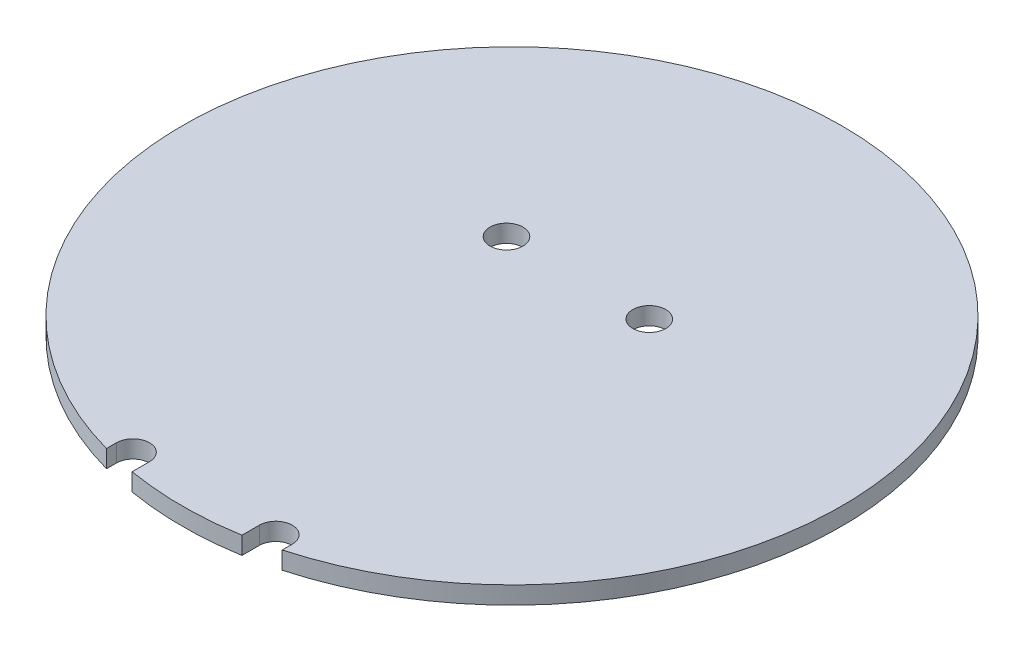
ISO-10303-21;
HEADER;
FILE_DESCRIPTION(('STEP AP214'),'2;1');
FILE_NAME('part.step','',(''),(''),'','','');
FILE_SCHEMA(('AUTOMOTIVE_DESIGN { 1 0 10303 214 1 1 1 1 }'));
ENDSEC;
DATA;
#1=APPLICATION_CONTEXT('core data for automotive mechanical design processes');
#2=APPLICATION_PROTOCOL_DEFINITION('international standard','automotive_design',2000,#1);
#3=PRODUCT_CONTEXT('',#1,'mechanical');
#4=PRODUCT('Part','Part','',(#3));
#5=PRODUCT_RELATED_PRODUCT_CATEGORY('part','',(#4));
#6=PRODUCT_DEFINITION_FORMATION('','',#4);
#7=PRODUCT_DEFINITION_CONTEXT('part definition',#1,'design');
#8=PRODUCT_DEFINITION('design','',#6,#7);
#9=PRODUCT_DEFINITION_SHAPE('','',#8);
#10=(LENGTH_UNIT() NAMED_UNIT(*) SI_UNIT(.MILLI.,.METRE.));
#11=(NAMED_UNIT(*) PLANE_ANGLE_UNIT() SI_UNIT($,.RADIAN.));
#12=(NAMED_UNIT(*) SI_UNIT($,.STERADIAN.) SOLID_ANGLE_UNIT());
#13=UNCERTAINTY_MEASURE_WITH_UNIT(LENGTH_MEASURE(1.E-05),#10,'distance_accuracy_value','');
#14=(GEOMETRIC_REPRESENTATION_CONTEXT(3) GLOBAL_UNCERTAINTY_ASSIGNED_CONTEXT((#13)) GLOBAL_UNIT_ASSIGNED_CONTEXT((#10,
#11,#12)) REPRESENTATION_CONTEXT('',''));
#15=CARTESIAN_POINT('',(0.,0.,0.));
#16=DIRECTION('',(0.,0.,1.));
#17=DIRECTION('',(1.,0.,0.));
#18=AXIS2_PLACEMENT_3D('',#15,#16,#17);
#19=CARTESIAN_POINT('',(0.,0.,0.));
#20=DIRECTION('',(0.,1.,0.));
#21=DIRECTION('',(0.,0.,1.));
#22=AXIS2_PLACEMENT_3D('',#19,#20,#21);
#23=PLANE('',#22);
#24=DIRECTION('',(0.,0.,1.));
#25=VECTOR('',#24,1.);
#26=CARTESIAN_POINT('',(-3.99999999999991,0.,15.6468387489926));
#27=LINE('',#26,#25);
#28=CARTESIAN_POINT('',(-3.99999999999993,0.,14.));
#29=VERTEX_POINT('',#28);
#30=CARTESIAN_POINT('',(-3.99999999999991,0.,14.456832294801));
#31=VERTEX_POINT('',#30);
#32=EDGE_CURVE('E83',#29,#31,#27,.T.);
#33=ORIENTED_EDGE('',*,*,#32,.T.);
#34=CARTESIAN_POINT('',(0.,0.,0.));
#35=DIRECTION('',(0.,-1.,0.));
#36=DIRECTION('',(0.,0.,-1.));
#37=AXIS2_PLACEMENT_3D('',#34,#35,#36);
#38=CIRCLE('',#37,15.);
#39=CARTESIAN_POINT('',(4.00000000000009,0.,14.4568322948009));
#40=VERTEX_POINT('',#39);
#41=EDGE_CURVE('E138',#40,#31,#38,.F.);
#42=ORIENTED_EDGE('',*,*,#41,.F.);
#43=DIRECTION('',(0.,0.,1.));
#44=VECTOR('',#43,1.);
#45=CARTESIAN_POINT('',(4.00000000000009,0.,14.));
#46=LINE('',#45,#44);
#47=CARTESIAN_POINT('',(4.00000000000009,0.,14.));
#48=VERTEX_POINT('',#47);
#49=EDGE_CURVE('E107',#40,#48,#46,.F.);
#50=ORIENTED_EDGE('',*,*,#49,.T.);
#51=CARTESIAN_POINT('',(3.25000000000016,0.,14.));
#52=DIRECTION('',(0.,1.,0.));
#53=DIRECTION('',(0.,0.,1.));
#54=AXIS2_PLACEMENT_3D('',#51,#52,#53);
#55=CIRCLE('',#54,0.750000000000001);
#56=CARTESIAN_POINT('',(2.50000000000012,0.,14.));
#57=VERTEX_POINT('',#56);
#58=EDGE_CURVE('E113',#48,#57,#55,.T.);
#59=ORIENTED_EDGE('',*,*,#58,.T.);
#60=DIRECTION('',(0.,0.,1.));
#61=VECTOR('',#60,1.);
#62=CARTESIAN_POINT('',(2.50000000000009,0.,14.));
#63=LINE('',#62,#61);
#64=CARTESIAN_POINT('',(2.50000000000009,0.,14.790199457749));
#65=VERTEX_POINT('',#64);
#66=EDGE_CURVE('E111',#57,#65,#63,.T.);
#67=ORIENTED_EDGE('',*,*,#66,.T.);
#68=CARTESIAN_POINT('',(0.,0.,0.));
#69=DIRECTION('',(0.,-1.,0.));
#70=DIRECTION('',(0.,0.,-1.));
#71=AXIS2_PLACEMENT_3D('',#68,#69,#70);
#72=CIRCLE('',#71,15.);
#73=CARTESIAN_POINT('',(-2.49999999999993,0.,14.7901994577491));
#74=VERTEX_POINT('',#73);
#75=EDGE_CURVE('E140',#74,#65,#72,.F.);
#76=ORIENTED_EDGE('',*,*,#75,.F.);
#77=DIRECTION('',(0.,0.,1.));
#78=VECTOR('',#77,1.);
#79=CARTESIAN_POINT('',(-2.49999999999993,0.,14.));
#80=LINE('',#79,#78);
#81=CARTESIAN_POINT('',(-2.49999999999993,0.,14.));
#82=VERTEX_POINT('',#81);
#83=EDGE_CURVE('E79',#74,#82,#80,.F.);
#84=ORIENTED_EDGE('',*,*,#83,.T.);
#85=CARTESIAN_POINT('',(-3.24999999999995,0.,14.));
#86=DIRECTION('',(0.,1.,0.));
#87=DIRECTION('',(0.,0.,1.));
#88=AXIS2_PLACEMENT_3D('',#85,#86,#87);
#89=CIRCLE('',#88,0.750000000000001);
#90=EDGE_CURVE('E20',#82,#29,#89,.T.);
#91=ORIENTED_EDGE('',*,*,#90,.T.);
#92=EDGE_LOOP('',(#33,#42,#50,#59,#67,#76,#84,#91));
#93=FACE_BOUND('',#92,.T.);
#94=CARTESIAN_POINT('',(-3.24999999999999,0.,-3.));
#95=DIRECTION('',(0.,1.,0.));
#96=DIRECTION('',(0.,0.,1.));
#97=AXIS2_PLACEMENT_3D('',#94,#95,#96);
#98=CIRCLE('',#97,0.75);
#99=CARTESIAN_POINT('',(-3.24999999999999,0.,-2.25));
#100=VERTEX_POINT('',#99);
#101=EDGE_CURVE('E132',#100,#100,#98,.T.);
#102=ORIENTED_EDGE('',*,*,#101,.T.);
#103=EDGE_LOOP('',(#102));
#104=FACE_BOUND('',#103,.T.);
#105=CARTESIAN_POINT('',(3.2500000000001,0.,-2.99999999999999));
#106=DIRECTION('',(0.,1.,0.));
#107=DIRECTION('',(0.,0.,1.));
#108=AXIS2_PLACEMENT_3D('',#105,#106,#107);
#109=CIRCLE('',#108,0.750000000000001);
#110=CARTESIAN_POINT('',(3.2500000000001,0.,-2.24999999999999));
#111=VERTEX_POINT('',#110);
#112=EDGE_CURVE('E135',#111,#111,#109,.T.);
#113=ORIENTED_EDGE('',*,*,#112,.T.);
#114=EDGE_LOOP('',(#113));
#115=FACE_BOUND('',#114,.T.);
#116=ADVANCED_FACE('F17',(#93,#104,#115),#23,.F.);
#117=CARTESIAN_POINT('',(-3.99999999999991,0.,15.6468387489926));
#118=DIRECTION('',(-1.,0.,0.));
#119=DIRECTION('',(0.,-1.,0.));
#120=AXIS2_PLACEMENT_3D('',#117,#118,#119);
#121=PLANE('',#120);
#122=DIRECTION('',(0.,1.,0.));
#123=VECTOR('',#122,1.);
#124=CARTESIAN_POINT('',(-3.99999999999995,0.,14.));
#125=LINE('',#124,#123);
#126=CARTESIAN_POINT('',(-3.99999999999992,0.799999999999995,14.));
#127=VERTEX_POINT('',#126);
#128=EDGE_CURVE('E88',#29,#127,#125,.T.);
#129=ORIENTED_EDGE('',*,*,#128,.T.);
#130=DIRECTION('',(0.,0.,1.));
#131=VECTOR('',#130,1.);
#132=CARTESIAN_POINT('',(-3.99999999999989,0.799999999999995,0.));
#133=LINE('',#132,#131);
#134=CARTESIAN_POINT('',(-3.9999999999999,0.799999999999995,14.456832294801));
#135=VERTEX_POINT('',#134);
#136=EDGE_CURVE('E131',#135,#127,#133,.F.);
#137=ORIENTED_EDGE('',*,*,#136,.F.);
#138=DIRECTION('',(0.,-1.,0.));
#139=VECTOR('',#138,1.);
#140=CARTESIAN_POINT('',(-3.9999999999999,0.799999999999995,14.456832294801));
#141=LINE('',#140,#139);
#142=EDGE_CURVE('E94',#31,#135,#141,.F.);
#143=ORIENTED_EDGE('',*,*,#142,.F.);
#144=ORIENTED_EDGE('',*,*,#32,.F.);
#145=EDGE_LOOP('',(#129,#137,#143,#144));
#146=FACE_BOUND('',#145,.T.);
#147=ADVANCED_FACE('F90',(#146),#121,.F.);
#148=CARTESIAN_POINT('',(-3.24999999999995,0.,14.));
#149=DIRECTION('',(0.,1.,0.));
#150=DIRECTION('',(0.,0.,1.));
#151=AXIS2_PLACEMENT_3D('',#148,#149,#150);
#152=CYLINDRICAL_SURFACE('',#151,0.750000000000001);
#153=ORIENTED_EDGE('',*,*,#128,.F.);
#154=ORIENTED_EDGE('',*,*,#90,.F.);
#155=DIRECTION('',(0.,1.,0.));
#156=VECTOR('',#155,1.);
#157=CARTESIAN_POINT('',(-2.49999999999993,0.,14.));
#158=LINE('',#157,#156);
#159=CARTESIAN_POINT('',(-2.49999999999993,0.799999999999995,14.));
#160=VERTEX_POINT('',#159);
#161=EDGE_CURVE('E102',#82,#160,#158,.T.);
#162=ORIENTED_EDGE('',*,*,#161,.T.);
#163=CARTESIAN_POINT('',(-3.24999999999995,0.799999999999995,14.));
#164=DIRECTION('',(0.,1.,0.));
#165=DIRECTION('',(0.,0.,1.));
#166=AXIS2_PLACEMENT_3D('',#163,#164,#165);
#167=CIRCLE('',#166,0.750000000000001);
#168=EDGE_CURVE('E99',#127,#160,#167,.F.);
#169=ORIENTED_EDGE('',*,*,#168,.F.);
#170=EDGE_LOOP('',(#153,#154,#162,#169));
#171=FACE_BOUND('',#170,.T.);
#172=ADVANCED_FACE('F97',(#171),#152,.F.);
#173=CARTESIAN_POINT('',(-2.49999999999993,0.,14.));
#174=DIRECTION('',(1.,0.,0.));
#175=DIRECTION('',(0.,1.,0.));
#176=AXIS2_PLACEMENT_3D('',#173,#174,#175);
#177=PLANE('',#176);
#178=ORIENTED_EDGE('',*,*,#161,.F.);
#179=ORIENTED_EDGE('',*,*,#83,.F.);
#180=DIRECTION('',(0.,-1.,0.));
#181=VECTOR('',#180,1.);
#182=CARTESIAN_POINT('',(-2.49999999999992,0.799999999999995,14.7901994577491));
#183=LINE('',#182,#181);
#184=CARTESIAN_POINT('',(-2.49999999999993,0.799999999999995,14.7901994577491));
#185=VERTEX_POINT('',#184);
#186=EDGE_CURVE('E141',#185,#74,#183,.T.);
#187=ORIENTED_EDGE('',*,*,#186,.F.);
#188=DIRECTION('',(0.,0.,1.));
#189=VECTOR('',#188,1.);
#190=CARTESIAN_POINT('',(-2.49999999999993,0.799999999999995,0.));
#191=LINE('',#190,#189);
#192=EDGE_CURVE('E129',#160,#185,#191,.T.);
#193=ORIENTED_EDGE('',*,*,#192,.F.);
#194=EDGE_LOOP('',(#178,#179,#187,#193));
#195=FACE_BOUND('',#194,.T.);
#196=ADVANCED_FACE('F174',(#195),#177,.F.);
#197=CARTESIAN_POINT('',(0.,0.799999999999995,0.));
#198=DIRECTION('',(0.,-1.,0.));
#199=DIRECTION('',(0.,0.,-1.));
#200=AXIS2_PLACEMENT_3D('',#197,#198,#199);
#201=CYLINDRICAL_SURFACE('',#200,15.);
#202=ORIENTED_EDGE('',*,*,#75,.T.);
#203=DIRECTION('',(0.,-1.,0.));
#204=VECTOR('',#203,1.);
#205=CARTESIAN_POINT('',(2.50000000000009,0.,14.790199457749));
#206=LINE('',#205,#204);
#207=CARTESIAN_POINT('',(2.50000000000009,0.799999999999995,14.790199457749));
#208=VERTEX_POINT('',#207);
#209=EDGE_CURVE('E114',#65,#208,#206,.F.);
#210=ORIENTED_EDGE('',*,*,#209,.T.);
#211=CARTESIAN_POINT('',(0.,0.799999999999995,0.));
#212=DIRECTION('',(0.,-1.,0.));
#213=DIRECTION('',(0.,0.,-1.));
#214=AXIS2_PLACEMENT_3D('',#211,#212,#213);
#215=CIRCLE('',#214,15.);
#216=EDGE_CURVE('E126',#185,#208,#215,.F.);
#217=ORIENTED_EDGE('',*,*,#216,.F.);
#218=ORIENTED_EDGE('',*,*,#186,.T.);
#219=EDGE_LOOP('',(#202,#210,#217,#218));
#220=FACE_BOUND('',#219,.T.);
#221=ADVANCED_FACE('F171',(#220),#201,.T.);
#222=CARTESIAN_POINT('',(2.50000000000009,0.,14.));
#223=DIRECTION('',(-1.,0.,0.));
#224=DIRECTION('',(0.,-1.,0.));
#225=AXIS2_PLACEMENT_3D('',#222,#223,#224);
#226=PLANE('',#225);
#227=DIRECTION('',(0.,1.,0.));
#228=VECTOR('',#227,1.);
#229=CARTESIAN_POINT('',(2.50000000000015,0.,14.));
#230=LINE('',#229,#228);
#231=CARTESIAN_POINT('',(2.50000000000012,0.799999999999995,14.));
#232=VERTEX_POINT('',#231);
#233=EDGE_CURVE('E110',#57,#232,#230,.T.);
#234=ORIENTED_EDGE('',*,*,#233,.T.);
#235=DIRECTION('',(0.,0.,1.));
#236=VECTOR('',#235,1.);
#237=CARTESIAN_POINT('',(2.50000000000009,0.799999999999995,0.));
#238=LINE('',#237,#236);
#239=EDGE_CURVE('E125',#208,#232,#238,.F.);
#240=ORIENTED_EDGE('',*,*,#239,.F.);
#241=ORIENTED_EDGE('',*,*,#209,.F.);
#242=ORIENTED_EDGE('',*,*,#66,.F.);
#243=EDGE_LOOP('',(#234,#240,#241,#242));
#244=FACE_BOUND('',#243,.T.);
#245=ADVANCED_FACE('F169',(#244),#226,.F.);
#246=CARTESIAN_POINT('',(3.25000000000016,0.,14.));
#247=DIRECTION('',(0.,1.,0.));
#248=DIRECTION('',(0.,0.,1.));
#249=AXIS2_PLACEMENT_3D('',#246,#247,#248);
#250=CYLINDRICAL_SURFACE('',#249,0.750000000000001);
#251=CARTESIAN_POINT('',(3.25000000000016,0.799999999999995,14.));
#252=DIRECTION('',(0.,1.,0.));
#253=DIRECTION('',(0.,0.,1.));
#254=AXIS2_PLACEMENT_3D('',#251,#252,#253);
#255=CIRCLE('',#254,0.750000000000001);
#256=CARTESIAN_POINT('',(4.00000000000009,0.799999999999995,14.));
#257=VERTEX_POINT('',#256);
#258=EDGE_CURVE('E122',#232,#257,#255,.F.);
#259=ORIENTED_EDGE('',*,*,#258,.F.);
#260=ORIENTED_EDGE('',*,*,#233,.F.);
#261=ORIENTED_EDGE('',*,*,#58,.F.);
#262=DIRECTION('',(0.,1.,0.));
#263=VECTOR('',#262,1.);
#264=CARTESIAN_POINT('',(4.00000000000009,0.,14.));
#265=LINE('',#264,#263);
#266=EDGE_CURVE('E109',#48,#257,#265,.T.);
#267=ORIENTED_EDGE('',*,*,#266,.T.);
#268=EDGE_LOOP('',(#259,#260,#261,#267));
#269=FACE_BOUND('',#268,.T.);
#270=ADVANCED_FACE('F164',(#269),#250,.F.);
#271=CARTESIAN_POINT('',(4.00000000000009,0.,14.));
#272=DIRECTION('',(1.,0.,0.));
#273=DIRECTION('',(0.,1.,0.));
#274=AXIS2_PLACEMENT_3D('',#271,#272,#273);
#275=PLANE('',#274);
#276=ORIENTED_EDGE('',*,*,#266,.F.);
#277=ORIENTED_EDGE('',*,*,#49,.F.);
#278=DIRECTION('',(0.,-1.,0.));
#279=VECTOR('',#278,1.);
#280=CARTESIAN_POINT('',(4.0000000000001,0.799999999999995,14.4568322948009));
#281=LINE('',#280,#279);
#282=CARTESIAN_POINT('',(4.0000000000001,0.799999999999995,14.4568322948009));
#283=VERTEX_POINT('',#282);
#284=EDGE_CURVE('E35',#283,#40,#281,.T.);
#285=ORIENTED_EDGE('',*,*,#284,.F.);
#286=DIRECTION('',(0.,0.,1.));
#287=VECTOR('',#286,1.);
#288=CARTESIAN_POINT('',(4.0000000000001,0.799999999999995,0.));
#289=LINE('',#288,#287);
#290=EDGE_CURVE('E121',#257,#283,#289,.T.);
#291=ORIENTED_EDGE('',*,*,#290,.F.);
#292=EDGE_LOOP('',(#276,#277,#285,#291));
#293=FACE_BOUND('',#292,.T.);
#294=ADVANCED_FACE('F161',(#293),#275,.F.);
#295=CARTESIAN_POINT('',(0.,0.799999999999995,0.));
#296=DIRECTION('',(0.,-1.,0.));
#297=DIRECTION('',(0.,0.,-1.));
#298=AXIS2_PLACEMENT_3D('',#295,#296,#297);
#299=CYLINDRICAL_SURFACE('',#298,15.);
#300=ORIENTED_EDGE('',*,*,#41,.T.);
#301=ORIENTED_EDGE('',*,*,#142,.T.);
#302=CARTESIAN_POINT('',(0.,0.799999999999995,0.));
#303=DIRECTION('',(0.,-1.,0.));
#304=DIRECTION('',(0.,0.,-1.));
#305=AXIS2_PLACEMENT_3D('',#302,#303,#304);
#306=CIRCLE('',#305,15.);
#307=EDGE_CURVE('E118',#283,#135,#306,.F.);
#308=ORIENTED_EDGE('',*,*,#307,.F.);
#309=ORIENTED_EDGE('',*,*,#284,.T.);
#310=EDGE_LOOP('',(#300,#301,#308,#309));
#311=FACE_BOUND('',#310,.T.);
#312=ADVANCED_FACE('F198',(#311),#299,.T.);
#313=CARTESIAN_POINT('',(3.2500000000001,0.,-2.99999999999999));
#314=DIRECTION('',(0.,1.,0.));
#315=DIRECTION('',(0.,0.,1.));
#316=AXIS2_PLACEMENT_3D('',#313,#314,#315);
#317=CYLINDRICAL_SURFACE('',#316,0.750000000000001);
#318=CARTESIAN_POINT('',(3.2500000000001,0.799999999999995,-2.99999999999999));
#319=DIRECTION('',(0.,1.,0.));
#320=DIRECTION('',(0.,0.,1.));
#321=AXIS2_PLACEMENT_3D('',#318,#319,#320);
#322=CIRCLE('',#321,0.750000000000001);
#323=CARTESIAN_POINT('',(3.2500000000001,0.799999999999995,-2.24999999999999));
#324=VERTEX_POINT('',#323);
#325=EDGE_CURVE('E26',#324,#324,#322,.F.);
#326=ORIENTED_EDGE('',*,*,#325,.F.);
#327=EDGE_LOOP('',(#326));
#328=FACE_BOUND('',#327,.T.);
#329=ORIENTED_EDGE('',*,*,#112,.F.);
#330=EDGE_LOOP('',(#329));
#331=FACE_BOUND('',#330,.T.);
#332=ADVANCED_FACE('F191',(#328,#331),#317,.F.);
#333=CARTESIAN_POINT('',(-3.24999999999999,0.,-3.));
#334=DIRECTION('',(0.,1.,0.));
#335=DIRECTION('',(0.,0.,1.));
#336=AXIS2_PLACEMENT_3D('',#333,#334,#335);
#337=CYLINDRICAL_SURFACE('',#336,0.75);
#338=CARTESIAN_POINT('',(-3.24999999999999,0.799999999999995,-3.));
#339=DIRECTION('',(0.,1.,0.));
#340=DIRECTION('',(0.,0.,1.));
#341=AXIS2_PLACEMENT_3D('',#338,#339,#340);
#342=CIRCLE('',#341,0.75);
#343=CARTESIAN_POINT('',(-3.24999999999999,0.799999999999995,-2.25));
#344=VERTEX_POINT('',#343);
#345=EDGE_CURVE('E11',#344,#344,#342,.F.);
#346=ORIENTED_EDGE('',*,*,#345,.F.);
#347=EDGE_LOOP('',(#346));
#348=FACE_BOUND('',#347,.T.);
#349=ORIENTED_EDGE('',*,*,#101,.F.);
#350=EDGE_LOOP('',(#349));
#351=FACE_BOUND('',#350,.T.);
#352=ADVANCED_FACE('F185',(#348,#351),#337,.F.);
#353=CARTESIAN_POINT('',(0.,0.799999999999995,0.));
#354=DIRECTION('',(0.,1.,0.));
#355=DIRECTION('',(0.,0.,1.));
#356=AXIS2_PLACEMENT_3D('',#353,#354,#355);
#357=PLANE('',#356);
#358=ORIENTED_EDGE('',*,*,#345,.T.);
#359=EDGE_LOOP('',(#358));
#360=FACE_BOUND('',#359,.T.);
#361=ORIENTED_EDGE('',*,*,#325,.T.);
#362=EDGE_LOOP('',(#361));
#363=FACE_BOUND('',#362,.T.);
#364=ORIENTED_EDGE('',*,*,#307,.T.);
#365=ORIENTED_EDGE('',*,*,#136,.T.);
#366=ORIENTED_EDGE('',*,*,#168,.T.);
#367=ORIENTED_EDGE('',*,*,#192,.T.);
#368=ORIENTED_EDGE('',*,*,#216,.T.);
#369=ORIENTED_EDGE('',*,*,#239,.T.);
#370=ORIENTED_EDGE('',*,*,#258,.T.);
#371=ORIENTED_EDGE('',*,*,#290,.T.);
#372=EDGE_LOOP('',(#364,#365,#366,#367,#368,#369,#370,#371));
#373=FACE_BOUND('',#372,.T.);
#374=ADVANCED_FACE('F158',(#360,#363,#373),#357,.T.);
#375=CLOSED_SHELL('',(#116,#147,#172,#196,#221,#245,#270,#294,#312,#332,#352,#374));
#376=MANIFOLD_SOLID_BREP('B1',#375);
#377=ADVANCED_BREP_SHAPE_REPRESENTATION('',(#18,#376),#14);
#378=SHAPE_DEFINITION_REPRESENTATION(#9,#377);
ENDSEC;
END-ISO-10303-21;
